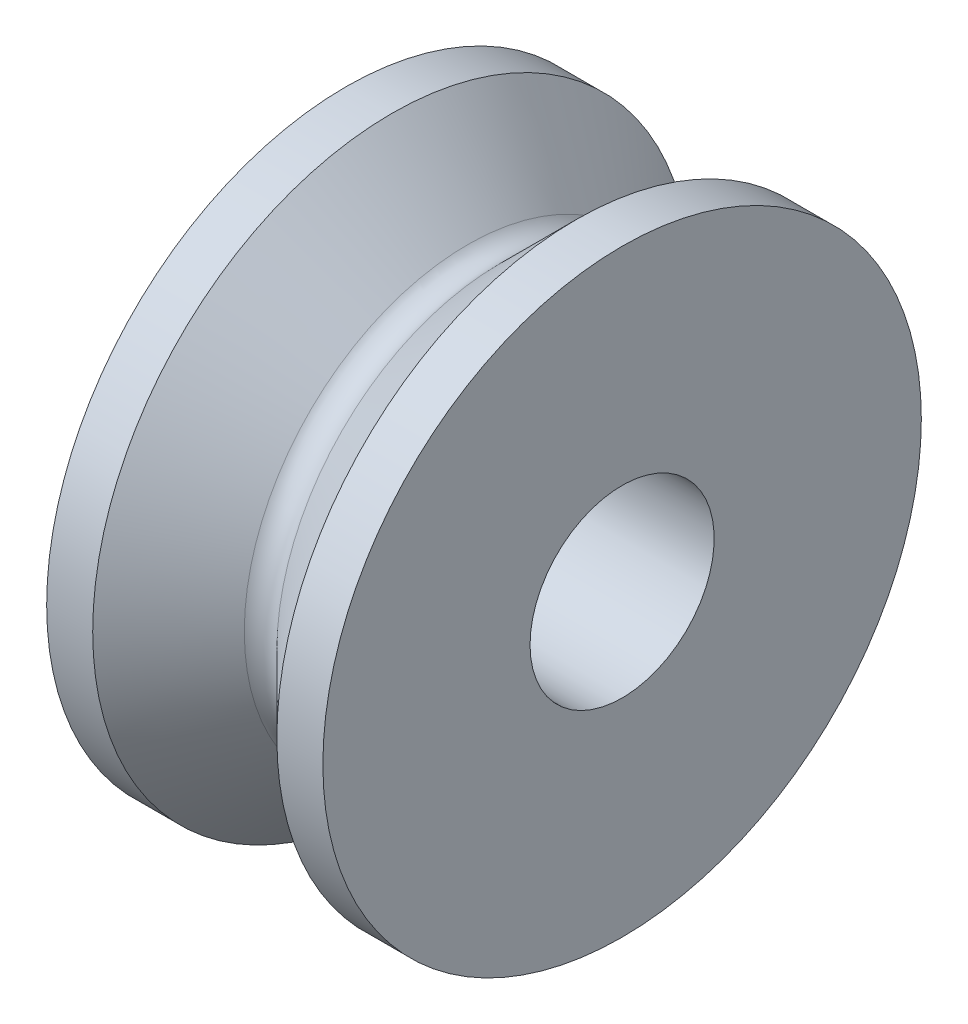
ISO-10303-21;
HEADER;
FILE_DESCRIPTION(('STEP AP214'),'2;1');
FILE_NAME('part.step','',(''),(''),'','','');
FILE_SCHEMA(('AUTOMOTIVE_DESIGN { 1 0 10303 214 1 1 1 1 }'));
ENDSEC;
DATA;
#1=APPLICATION_CONTEXT('core data for automotive mechanical design processes');
#2=APPLICATION_PROTOCOL_DEFINITION('international standard','automotive_design',2000,#1);
#3=PRODUCT_CONTEXT('',#1,'mechanical');
#4=PRODUCT('Part','Part','',(#3));
#5=PRODUCT_RELATED_PRODUCT_CATEGORY('part','',(#4));
#6=PRODUCT_DEFINITION_FORMATION('','',#4);
#7=PRODUCT_DEFINITION_CONTEXT('part definition',#1,'design');
#8=PRODUCT_DEFINITION('design','',#6,#7);
#9=PRODUCT_DEFINITION_SHAPE('','',#8);
#10=(LENGTH_UNIT() NAMED_UNIT(*) SI_UNIT(.MILLI.,.METRE.));
#11=(NAMED_UNIT(*) PLANE_ANGLE_UNIT() SI_UNIT($,.RADIAN.));
#12=(NAMED_UNIT(*) SI_UNIT($,.STERADIAN.) SOLID_ANGLE_UNIT());
#13=UNCERTAINTY_MEASURE_WITH_UNIT(LENGTH_MEASURE(1.E-05),#10,'distance_accuracy_value','');
#14=(GEOMETRIC_REPRESENTATION_CONTEXT(3) GLOBAL_UNCERTAINTY_ASSIGNED_CONTEXT((#13)) GLOBAL_UNIT_ASSIGNED_CONTEXT((#10,
#11,#12)) REPRESENTATION_CONTEXT('',''));
#15=CARTESIAN_POINT('',(0.,0.,0.));
#16=DIRECTION('',(0.,0.,1.));
#17=DIRECTION('',(1.,0.,0.));
#18=AXIS2_PLACEMENT_3D('',#15,#16,#17);
#19=CARTESIAN_POINT('',(-66.4316676931423,0.,0.));
#20=DIRECTION('',(-1.,0.,0.));
#21=DIRECTION('',(0.,0.,1.));
#22=AXIS2_PLACEMENT_3D('',#19,#20,#21);
#23=CYLINDRICAL_SURFACE('',#22,2.);
#24=CARTESIAN_POINT('',(-2.99999999999999,0.,0.));
#25=DIRECTION('',(-1.,0.,0.));
#26=DIRECTION('',(0.,0.,1.));
#27=AXIS2_PLACEMENT_3D('',#24,#25,#26);
#28=CIRCLE('',#27,2.);
#29=CARTESIAN_POINT('',(-2.99999999999999,0.,2.));
#30=VERTEX_POINT('',#29);
#31=EDGE_CURVE('E43',#30,#30,#28,.T.);
#32=ORIENTED_EDGE('',*,*,#31,.T.);
#33=EDGE_LOOP('',(#32));
#34=FACE_BOUND('',#33,.T.);
#35=CARTESIAN_POINT('',(2.99999999999999,0.,0.));
#36=DIRECTION('',(-1.,0.,0.));
#37=DIRECTION('',(0.,0.,1.));
#38=AXIS2_PLACEMENT_3D('',#35,#36,#37);
#39=CIRCLE('',#38,2.);
#40=CARTESIAN_POINT('',(2.99999999999999,0.,2.));
#41=VERTEX_POINT('',#40);
#42=EDGE_CURVE('E55',#41,#41,#39,.T.);
#43=ORIENTED_EDGE('',*,*,#42,.F.);
#44=EDGE_LOOP('',(#43));
#45=FACE_BOUND('',#44,.T.);
#46=ADVANCED_FACE('F32',(#34,#45),#23,.F.);
#47=CARTESIAN_POINT('',(-2.99999999999999,2.,0.));
#48=DIRECTION('',(1.,0.,0.));
#49=DIRECTION('',(0.,0.,-1.));
#50=AXIS2_PLACEMENT_3D('',#47,#48,#49);
#51=PLANE('',#50);
#52=ORIENTED_EDGE('',*,*,#31,.F.);
#53=EDGE_LOOP('',(#52));
#54=FACE_BOUND('',#53,.T.);
#55=CARTESIAN_POINT('',(-2.99999999999999,0.,0.));
#56=DIRECTION('',(-1.,0.,0.));
#57=DIRECTION('',(0.,0.,1.));
#58=AXIS2_PLACEMENT_3D('',#55,#56,#57);
#59=CIRCLE('',#58,6.5);
#60=CARTESIAN_POINT('',(-2.99999999999999,0.,6.5));
#61=VERTEX_POINT('',#60);
#62=EDGE_CURVE('E47',#61,#61,#59,.T.);
#63=ORIENTED_EDGE('',*,*,#62,.T.);
#64=EDGE_LOOP('',(#63));
#65=FACE_BOUND('',#64,.T.);
#66=ADVANCED_FACE('F81',(#54,#65),#51,.F.);
#67=CARTESIAN_POINT('',(-66.4316676931423,0.,0.));
#68=DIRECTION('',(-1.,0.,0.));
#69=DIRECTION('',(0.,0.,1.));
#70=AXIS2_PLACEMENT_3D('',#67,#68,#69);
#71=CYLINDRICAL_SURFACE('',#70,6.5);
#72=ORIENTED_EDGE('',*,*,#62,.F.);
#73=EDGE_LOOP('',(#72));
#74=FACE_BOUND('',#73,.T.);
#75=CARTESIAN_POINT('',(-1.99999999999999,0.,0.));
#76=DIRECTION('',(-1.,0.,0.));
#77=DIRECTION('',(0.,0.,1.));
#78=AXIS2_PLACEMENT_3D('',#75,#76,#77);
#79=CIRCLE('',#78,6.5);
#80=CARTESIAN_POINT('',(-1.99999999999999,0.,6.5));
#81=VERTEX_POINT('',#80);
#82=EDGE_CURVE('E52',#81,#81,#79,.T.);
#83=ORIENTED_EDGE('',*,*,#82,.T.);
#84=EDGE_LOOP('',(#83));
#85=FACE_BOUND('',#84,.T.);
#86=ADVANCED_FACE('F86',(#74,#85),#71,.T.);
#87=CARTESIAN_POINT('',(0.,0.,0.));
#88=DIRECTION('',(-1.,0.,0.));
#89=DIRECTION('',(0.,0.,1.));
#90=AXIS2_PLACEMENT_3D('',#87,#88,#89);
#91=CONICAL_SURFACE('',#90,4.5,0.785398163397448);
#92=CARTESIAN_POINT('',(-0.353553390593273,0.,0.));
#93=DIRECTION('',(-1.,0.,0.));
#94=DIRECTION('',(0.,0.,1.));
#95=AXIS2_PLACEMENT_3D('',#92,#93,#94);
#96=CIRCLE('',#95,4.85355339059328);
#97=CARTESIAN_POINT('',(-0.353553390593273,0.,4.85355339059328));
#98=VERTEX_POINT('',#97);
#99=EDGE_CURVE('E39',#98,#98,#96,.T.);
#100=ORIENTED_EDGE('',*,*,#99,.T.);
#101=EDGE_LOOP('',(#100));
#102=FACE_BOUND('',#101,.T.);
#103=ORIENTED_EDGE('',*,*,#82,.F.);
#104=EDGE_LOOP('',(#103));
#105=FACE_BOUND('',#104,.T.);
#106=ADVANCED_FACE('F77',(#102,#105),#91,.T.);
#107=CARTESIAN_POINT('',(2.99999999999999,2.,0.));
#108=DIRECTION('',(-1.,0.,0.));
#109=DIRECTION('',(0.,0.,-1.));
#110=AXIS2_PLACEMENT_3D('',#107,#108,#109);
#111=PLANE('',#110);
#112=ORIENTED_EDGE('',*,*,#42,.T.);
#113=EDGE_LOOP('',(#112));
#114=FACE_BOUND('',#113,.T.);
#115=CARTESIAN_POINT('',(2.99999999999999,0.,0.));
#116=DIRECTION('',(-1.,0.,0.));
#117=DIRECTION('',(0.,0.,1.));
#118=AXIS2_PLACEMENT_3D('',#115,#116,#117);
#119=CIRCLE('',#118,6.5);
#120=CARTESIAN_POINT('',(2.99999999999999,0.,6.5));
#121=VERTEX_POINT('',#120);
#122=EDGE_CURVE('E58',#121,#121,#119,.T.);
#123=ORIENTED_EDGE('',*,*,#122,.F.);
#124=EDGE_LOOP('',(#123));
#125=FACE_BOUND('',#124,.T.);
#126=ADVANCED_FACE('F69',(#114,#125),#111,.F.);
#127=CARTESIAN_POINT('',(66.4316676931423,0.,0.));
#128=DIRECTION('',(1.,0.,0.));
#129=DIRECTION('',(0.,0.,1.));
#130=AXIS2_PLACEMENT_3D('',#127,#128,#129);
#131=CYLINDRICAL_SURFACE('',#130,6.5);
#132=ORIENTED_EDGE('',*,*,#122,.T.);
#133=EDGE_LOOP('',(#132));
#134=FACE_BOUND('',#133,.T.);
#135=CARTESIAN_POINT('',(1.99999999999999,0.,0.));
#136=DIRECTION('',(-1.,0.,0.));
#137=DIRECTION('',(0.,0.,1.));
#138=AXIS2_PLACEMENT_3D('',#135,#136,#137);
#139=CIRCLE('',#138,6.5);
#140=CARTESIAN_POINT('',(1.99999999999999,0.,6.5));
#141=VERTEX_POINT('',#140);
#142=EDGE_CURVE('E61',#141,#141,#139,.T.);
#143=ORIENTED_EDGE('',*,*,#142,.F.);
#144=EDGE_LOOP('',(#143));
#145=FACE_BOUND('',#144,.T.);
#146=ADVANCED_FACE('F67',(#134,#145),#131,.T.);
#147=CARTESIAN_POINT('',(0.,0.,0.));
#148=DIRECTION('',(1.,0.,0.));
#149=DIRECTION('',(0.,0.,1.));
#150=AXIS2_PLACEMENT_3D('',#147,#148,#149);
#151=CONICAL_SURFACE('',#150,4.5,0.785398163397448);
#152=CARTESIAN_POINT('',(0.353553390593273,0.,0.));
#153=DIRECTION('',(1.,0.,0.));
#154=DIRECTION('',(0.,0.,-1.));
#155=AXIS2_PLACEMENT_3D('',#152,#153,#154);
#156=CIRCLE('',#155,4.85355339059328);
#157=CARTESIAN_POINT('',(0.353553390593273,0.,-4.85355339059328));
#158=VERTEX_POINT('',#157);
#159=EDGE_CURVE('E10',#158,#158,#156,.T.);
#160=ORIENTED_EDGE('',*,*,#159,.T.);
#161=EDGE_LOOP('',(#160));
#162=FACE_BOUND('',#161,.T.);
#163=ORIENTED_EDGE('',*,*,#142,.T.);
#164=EDGE_LOOP('',(#163));
#165=FACE_BOUND('',#164,.T.);
#166=ADVANCED_FACE('F65',(#162,#165),#151,.T.);
#167=CARTESIAN_POINT('',(0.,0.,0.));
#168=DIRECTION('',(-1.,0.,0.));
#169=DIRECTION('',(0.,0.,1.));
#170=AXIS2_PLACEMENT_3D('',#167,#168,#169);
#171=TOROIDAL_SURFACE('',#170,5.20710678118656,0.5);
#172=ORIENTED_EDGE('',*,*,#159,.F.);
#173=EDGE_LOOP('',(#172));
#174=FACE_BOUND('',#173,.T.);
#175=ORIENTED_EDGE('',*,*,#99,.F.);
#176=EDGE_LOOP('',(#175));
#177=FACE_BOUND('',#176,.T.);
#178=ADVANCED_FACE('F34',(#174,#177),#171,.F.);
#179=CLOSED_SHELL('',(#46,#66,#86,#106,#126,#146,#166,#178));
#180=MANIFOLD_SOLID_BREP('B2',#179);
#181=ADVANCED_BREP_SHAPE_REPRESENTATION('',(#18,#180),#14);
#182=SHAPE_DEFINITION_REPRESENTATION(#9,#181);
ENDSEC;
END-ISO-10303-21;
